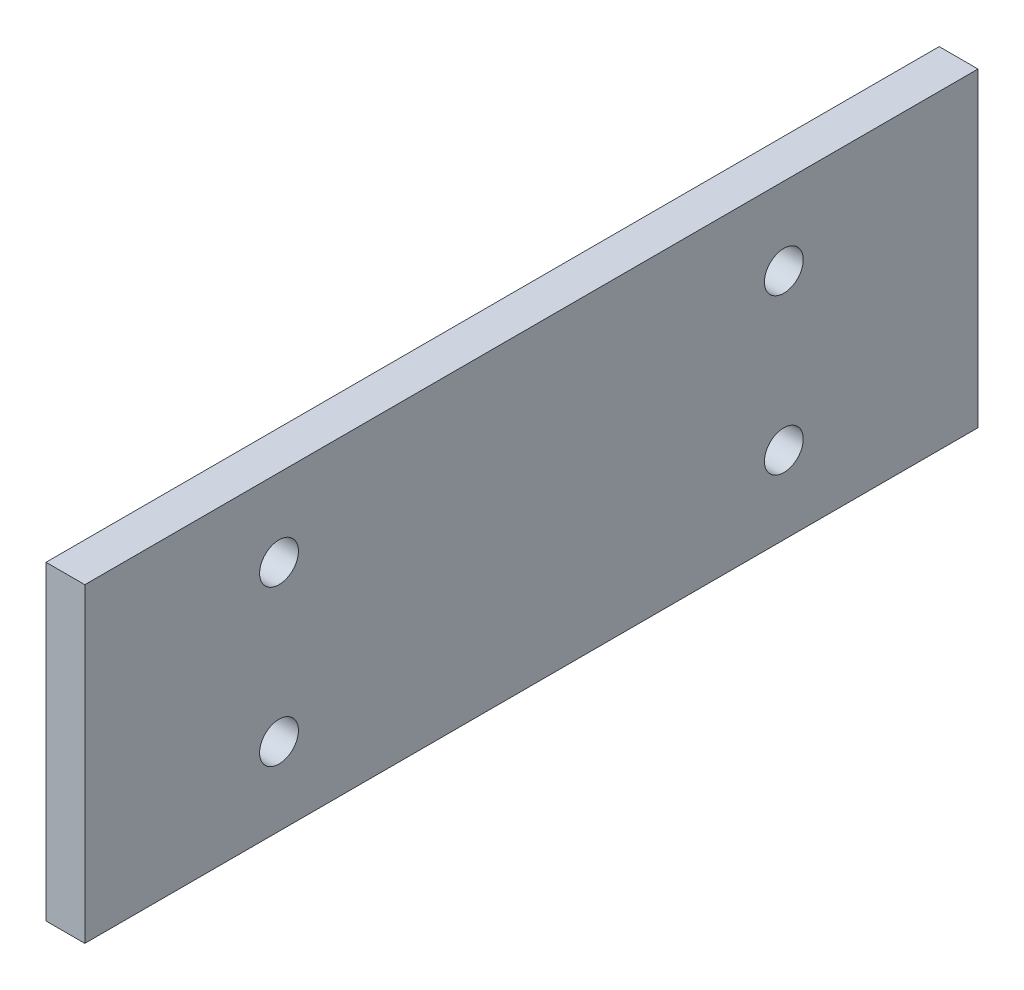
ISO-10303-21;
HEADER;
FILE_DESCRIPTION(('STEP AP214'),'2;1');
FILE_NAME('part.step','',(''),(''),'','','');
FILE_SCHEMA(('AUTOMOTIVE_DESIGN { 1 0 10303 214 1 1 1 1 }'));
ENDSEC;
DATA;
#1=APPLICATION_CONTEXT('core data for automotive mechanical design processes');
#2=APPLICATION_PROTOCOL_DEFINITION('international standard','automotive_design',2000,#1);
#3=PRODUCT_CONTEXT('',#1,'mechanical');
#4=PRODUCT('Part','Part','',(#3));
#5=PRODUCT_RELATED_PRODUCT_CATEGORY('part','',(#4));
#6=PRODUCT_DEFINITION_FORMATION('','',#4);
#7=PRODUCT_DEFINITION_CONTEXT('part definition',#1,'design');
#8=PRODUCT_DEFINITION('design','',#6,#7);
#9=PRODUCT_DEFINITION_SHAPE('','',#8);
#10=(LENGTH_UNIT() NAMED_UNIT(*) SI_UNIT(.MILLI.,.METRE.));
#11=(NAMED_UNIT(*) PLANE_ANGLE_UNIT() SI_UNIT($,.RADIAN.));
#12=(NAMED_UNIT(*) SI_UNIT($,.STERADIAN.) SOLID_ANGLE_UNIT());
#13=UNCERTAINTY_MEASURE_WITH_UNIT(LENGTH_MEASURE(1.E-05),#10,'distance_accuracy_value','');
#14=(GEOMETRIC_REPRESENTATION_CONTEXT(3) GLOBAL_UNCERTAINTY_ASSIGNED_CONTEXT((#13)) GLOBAL_UNIT_ASSIGNED_CONTEXT((#10,
#11,#12)) REPRESENTATION_CONTEXT('',''));
#15=CARTESIAN_POINT('',(0.,0.,0.));
#16=DIRECTION('',(0.,0.,1.));
#17=DIRECTION('',(1.,0.,0.));
#18=AXIS2_PLACEMENT_3D('',#15,#16,#17);
#19=CARTESIAN_POINT('',(5.,0.,0.));
#20=DIRECTION('',(1.,0.,0.));
#21=DIRECTION('',(0.,0.,-1.));
#22=AXIS2_PLACEMENT_3D('',#19,#20,#21);
#23=PLANE('',#22);
#24=CARTESIAN_POINT('',(5.,9.99999999999998,25.));
#25=DIRECTION('',(1.,0.,0.));
#26=DIRECTION('',(0.,0.,1.));
#27=AXIS2_PLACEMENT_3D('',#24,#25,#26);
#28=CIRCLE('',#27,2.5);
#29=CARTESIAN_POINT('',(5.,9.99999999999998,27.5));
#30=VERTEX_POINT('',#29);
#31=EDGE_CURVE('E148',#30,#30,#28,.T.);
#32=ORIENTED_EDGE('',*,*,#31,.F.);
#33=EDGE_LOOP('',(#32));
#34=FACE_BOUND('',#33,.T.);
#35=CARTESIAN_POINT('',(5.,30.,90.));
#36=DIRECTION('',(1.,0.,0.));
#37=DIRECTION('',(0.,0.,-1.));
#38=AXIS2_PLACEMENT_3D('',#35,#36,#37);
#39=CIRCLE('',#38,2.5);
#40=CARTESIAN_POINT('',(5.,30.,87.5));
#41=VERTEX_POINT('',#40);
#42=EDGE_CURVE('E118',#41,#41,#39,.T.);
#43=ORIENTED_EDGE('',*,*,#42,.F.);
#44=EDGE_LOOP('',(#43));
#45=FACE_BOUND('',#44,.T.);
#46=DIRECTION('',(0.,1.,0.));
#47=VECTOR('',#46,1.);
#48=CARTESIAN_POINT('',(5.,0.,0.));
#49=LINE('',#48,#47);
#50=CARTESIAN_POINT('',(5.,0.,0.));
#51=VERTEX_POINT('',#50);
#52=CARTESIAN_POINT('',(5.,40.,0.));
#53=VERTEX_POINT('',#52);
#54=EDGE_CURVE('E98',#51,#53,#49,.T.);
#55=ORIENTED_EDGE('',*,*,#54,.T.);
#56=DIRECTION('',(0.,0.,1.));
#57=VECTOR('',#56,1.);
#58=CARTESIAN_POINT('',(5.,40.,0.));
#59=LINE('',#58,#57);
#60=CARTESIAN_POINT('',(5.,40.,115.));
#61=VERTEX_POINT('',#60);
#62=EDGE_CURVE('E93',#53,#61,#59,.T.);
#63=ORIENTED_EDGE('',*,*,#62,.T.);
#64=DIRECTION('',(0.,-1.,0.));
#65=VECTOR('',#64,1.);
#66=CARTESIAN_POINT('',(5.,0.,115.));
#67=LINE('',#66,#65);
#68=CARTESIAN_POINT('',(5.,0.,115.));
#69=VERTEX_POINT('',#68);
#70=EDGE_CURVE('E96',#61,#69,#67,.T.);
#71=ORIENTED_EDGE('',*,*,#70,.T.);
#72=DIRECTION('',(0.,0.,-1.));
#73=VECTOR('',#72,1.);
#74=CARTESIAN_POINT('',(5.,0.,0.));
#75=LINE('',#74,#73);
#76=EDGE_CURVE('E63',#69,#51,#75,.T.);
#77=ORIENTED_EDGE('',*,*,#76,.T.);
#78=EDGE_LOOP('',(#55,#63,#71,#77));
#79=FACE_BOUND('',#78,.T.);
#80=CARTESIAN_POINT('',(5.,9.99999999999998,90.));
#81=DIRECTION('',(1.,0.,0.));
#82=DIRECTION('',(0.,0.,-1.));
#83=AXIS2_PLACEMENT_3D('',#80,#81,#82);
#84=CIRCLE('',#83,2.5);
#85=CARTESIAN_POINT('',(5.,9.99999999999998,87.5));
#86=VERTEX_POINT('',#85);
#87=EDGE_CURVE('E140',#86,#86,#84,.T.);
#88=ORIENTED_EDGE('',*,*,#87,.F.);
#89=EDGE_LOOP('',(#88));
#90=FACE_BOUND('',#89,.T.);
#91=CARTESIAN_POINT('',(5.,30.,25.));
#92=DIRECTION('',(1.,0.,0.));
#93=DIRECTION('',(0.,0.,1.));
#94=AXIS2_PLACEMENT_3D('',#91,#92,#93);
#95=CIRCLE('',#94,2.5);
#96=CARTESIAN_POINT('',(5.,30.,27.5));
#97=VERTEX_POINT('',#96);
#98=EDGE_CURVE('E156',#97,#97,#95,.T.);
#99=ORIENTED_EDGE('',*,*,#98,.F.);
#100=EDGE_LOOP('',(#99));
#101=FACE_BOUND('',#100,.T.);
#102=ADVANCED_FACE('F45',(#34,#45,#79,#90,#101),#23,.T.);
#103=CARTESIAN_POINT('',(0.,0.,0.));
#104=DIRECTION('',(1.,0.,0.));
#105=DIRECTION('',(0.,0.,-1.));
#106=AXIS2_PLACEMENT_3D('',#103,#104,#105);
#107=PLANE('',#106);
#108=DIRECTION('',(0.,1.,0.));
#109=VECTOR('',#108,1.);
#110=CARTESIAN_POINT('',(0.,0.,0.));
#111=LINE('',#110,#109);
#112=CARTESIAN_POINT('',(0.,0.,0.));
#113=VERTEX_POINT('',#112);
#114=CARTESIAN_POINT('',(0.,40.,0.));
#115=VERTEX_POINT('',#114);
#116=EDGE_CURVE('E114',#113,#115,#111,.T.);
#117=ORIENTED_EDGE('',*,*,#116,.F.);
#118=DIRECTION('',(0.,0.,-1.));
#119=VECTOR('',#118,1.);
#120=CARTESIAN_POINT('',(0.,0.,0.));
#121=LINE('',#120,#119);
#122=CARTESIAN_POINT('',(0.,0.,115.));
#123=VERTEX_POINT('',#122);
#124=EDGE_CURVE('E86',#123,#113,#121,.T.);
#125=ORIENTED_EDGE('',*,*,#124,.F.);
#126=DIRECTION('',(0.,-1.,0.));
#127=VECTOR('',#126,1.);
#128=CARTESIAN_POINT('',(0.,0.,115.));
#129=LINE('',#128,#127);
#130=CARTESIAN_POINT('',(0.,40.,115.));
#131=VERTEX_POINT('',#130);
#132=EDGE_CURVE('E80',#131,#123,#129,.T.);
#133=ORIENTED_EDGE('',*,*,#132,.F.);
#134=DIRECTION('',(0.,0.,1.));
#135=VECTOR('',#134,1.);
#136=CARTESIAN_POINT('',(0.,40.,0.));
#137=LINE('',#136,#135);
#138=EDGE_CURVE('E103',#115,#131,#137,.T.);
#139=ORIENTED_EDGE('',*,*,#138,.F.);
#140=EDGE_LOOP('',(#117,#125,#133,#139));
#141=FACE_BOUND('',#140,.T.);
#142=CARTESIAN_POINT('',(0.,30.,90.));
#143=DIRECTION('',(1.,0.,0.));
#144=DIRECTION('',(0.,0.,-1.));
#145=AXIS2_PLACEMENT_3D('',#142,#143,#144);
#146=CIRCLE('',#145,2.5);
#147=CARTESIAN_POINT('',(0.,30.,87.5));
#148=VERTEX_POINT('',#147);
#149=EDGE_CURVE('E136',#148,#148,#146,.T.);
#150=ORIENTED_EDGE('',*,*,#149,.T.);
#151=EDGE_LOOP('',(#150));
#152=FACE_BOUND('',#151,.T.);
#153=CARTESIAN_POINT('',(0.,9.99999999999998,90.));
#154=DIRECTION('',(1.,0.,0.));
#155=DIRECTION('',(0.,0.,-1.));
#156=AXIS2_PLACEMENT_3D('',#153,#154,#155);
#157=CIRCLE('',#156,2.5);
#158=CARTESIAN_POINT('',(0.,9.99999999999998,87.5));
#159=VERTEX_POINT('',#158);
#160=EDGE_CURVE('E144',#159,#159,#157,.T.);
#161=ORIENTED_EDGE('',*,*,#160,.T.);
#162=EDGE_LOOP('',(#161));
#163=FACE_BOUND('',#162,.T.);
#164=CARTESIAN_POINT('',(0.,9.99999999999998,25.));
#165=DIRECTION('',(1.,0.,0.));
#166=DIRECTION('',(0.,0.,1.));
#167=AXIS2_PLACEMENT_3D('',#164,#165,#166);
#168=CIRCLE('',#167,2.5);
#169=CARTESIAN_POINT('',(0.,9.99999999999998,27.5));
#170=VERTEX_POINT('',#169);
#171=EDGE_CURVE('E152',#170,#170,#168,.T.);
#172=ORIENTED_EDGE('',*,*,#171,.T.);
#173=EDGE_LOOP('',(#172));
#174=FACE_BOUND('',#173,.T.);
#175=CARTESIAN_POINT('',(0.,30.,25.));
#176=DIRECTION('',(1.,0.,0.));
#177=DIRECTION('',(0.,0.,1.));
#178=AXIS2_PLACEMENT_3D('',#175,#176,#177);
#179=CIRCLE('',#178,2.5);
#180=CARTESIAN_POINT('',(0.,30.,27.5));
#181=VERTEX_POINT('',#180);
#182=EDGE_CURVE('E160',#181,#181,#179,.T.);
#183=ORIENTED_EDGE('',*,*,#182,.T.);
#184=EDGE_LOOP('',(#183));
#185=FACE_BOUND('',#184,.T.);
#186=ADVANCED_FACE('F131',(#141,#152,#163,#174,#185),#107,.F.);
#187=CARTESIAN_POINT('',(5.,0.,0.));
#188=DIRECTION('',(0.,0.,1.));
#189=DIRECTION('',(0.,-1.,0.));
#190=AXIS2_PLACEMENT_3D('',#187,#188,#189);
#191=PLANE('',#190);
#192=ORIENTED_EDGE('',*,*,#116,.T.);
#193=DIRECTION('',(-1.,0.,0.));
#194=VECTOR('',#193,1.);
#195=CARTESIAN_POINT('',(5.,40.,0.));
#196=LINE('',#195,#194);
#197=EDGE_CURVE('E11',#53,#115,#196,.T.);
#198=ORIENTED_EDGE('',*,*,#197,.F.);
#199=ORIENTED_EDGE('',*,*,#54,.F.);
#200=DIRECTION('',(-1.,0.,0.));
#201=VECTOR('',#200,1.);
#202=CARTESIAN_POINT('',(5.,0.,0.));
#203=LINE('',#202,#201);
#204=EDGE_CURVE('E110',#51,#113,#203,.T.);
#205=ORIENTED_EDGE('',*,*,#204,.T.);
#206=EDGE_LOOP('',(#192,#198,#199,#205));
#207=FACE_BOUND('',#206,.T.);
#208=ADVANCED_FACE('F47',(#207),#191,.F.);
#209=CARTESIAN_POINT('',(5.,40.,0.));
#210=DIRECTION('',(0.,-1.,0.));
#211=DIRECTION('',(0.,0.,-1.));
#212=AXIS2_PLACEMENT_3D('',#209,#210,#211);
#213=PLANE('',#212);
#214=ORIENTED_EDGE('',*,*,#138,.T.);
#215=DIRECTION('',(-1.,0.,0.));
#216=VECTOR('',#215,1.);
#217=CARTESIAN_POINT('',(5.,40.,115.));
#218=LINE('',#217,#216);
#219=EDGE_CURVE('E55',#61,#131,#218,.T.);
#220=ORIENTED_EDGE('',*,*,#219,.F.);
#221=ORIENTED_EDGE('',*,*,#62,.F.);
#222=ORIENTED_EDGE('',*,*,#197,.T.);
#223=EDGE_LOOP('',(#214,#220,#221,#222));
#224=FACE_BOUND('',#223,.T.);
#225=ADVANCED_FACE('F102',(#224),#213,.F.);
#226=CARTESIAN_POINT('',(5.,0.,115.));
#227=DIRECTION('',(0.,0.,-1.));
#228=DIRECTION('',(-1.,0.,0.));
#229=AXIS2_PLACEMENT_3D('',#226,#227,#228);
#230=PLANE('',#229);
#231=ORIENTED_EDGE('',*,*,#132,.T.);
#232=DIRECTION('',(-1.,0.,0.));
#233=VECTOR('',#232,1.);
#234=CARTESIAN_POINT('',(5.,0.,115.));
#235=LINE('',#234,#233);
#236=EDGE_CURVE('E105',#69,#123,#235,.T.);
#237=ORIENTED_EDGE('',*,*,#236,.F.);
#238=ORIENTED_EDGE('',*,*,#70,.F.);
#239=ORIENTED_EDGE('',*,*,#219,.T.);
#240=EDGE_LOOP('',(#231,#237,#238,#239));
#241=FACE_BOUND('',#240,.T.);
#242=ADVANCED_FACE('F106',(#241),#230,.F.);
#243=CARTESIAN_POINT('',(5.,0.,0.));
#244=DIRECTION('',(0.,1.,0.));
#245=DIRECTION('',(0.,0.,1.));
#246=AXIS2_PLACEMENT_3D('',#243,#244,#245);
#247=PLANE('',#246);
#248=ORIENTED_EDGE('',*,*,#124,.T.);
#249=ORIENTED_EDGE('',*,*,#204,.F.);
#250=ORIENTED_EDGE('',*,*,#76,.F.);
#251=ORIENTED_EDGE('',*,*,#236,.T.);
#252=EDGE_LOOP('',(#248,#249,#250,#251));
#253=FACE_BOUND('',#252,.T.);
#254=ADVANCED_FACE('F128',(#253),#247,.F.);
#255=CARTESIAN_POINT('',(5.,30.,90.));
#256=DIRECTION('',(-1.,0.,0.));
#257=DIRECTION('',(0.,0.,1.));
#258=AXIS2_PLACEMENT_3D('',#255,#256,#257);
#259=CYLINDRICAL_SURFACE('',#258,2.5);
#260=ORIENTED_EDGE('',*,*,#42,.T.);
#261=EDGE_LOOP('',(#260));
#262=FACE_BOUND('',#261,.T.);
#263=ORIENTED_EDGE('',*,*,#149,.F.);
#264=EDGE_LOOP('',(#263));
#265=FACE_BOUND('',#264,.T.);
#266=ADVANCED_FACE('F181',(#262,#265),#259,.F.);
#267=CARTESIAN_POINT('',(5.,9.99999999999998,90.));
#268=DIRECTION('',(-1.,0.,0.));
#269=DIRECTION('',(0.,0.,1.));
#270=AXIS2_PLACEMENT_3D('',#267,#268,#269);
#271=CYLINDRICAL_SURFACE('',#270,2.5);
#272=ORIENTED_EDGE('',*,*,#87,.T.);
#273=EDGE_LOOP('',(#272));
#274=FACE_BOUND('',#273,.T.);
#275=ORIENTED_EDGE('',*,*,#160,.F.);
#276=EDGE_LOOP('',(#275));
#277=FACE_BOUND('',#276,.T.);
#278=ADVANCED_FACE('F226',(#274,#277),#271,.F.);
#279=CARTESIAN_POINT('',(5.,9.99999999999998,25.));
#280=DIRECTION('',(-1.,0.,0.));
#281=DIRECTION('',(0.,0.,1.));
#282=AXIS2_PLACEMENT_3D('',#279,#280,#281);
#283=CYLINDRICAL_SURFACE('',#282,2.5);
#284=ORIENTED_EDGE('',*,*,#31,.T.);
#285=EDGE_LOOP('',(#284));
#286=FACE_BOUND('',#285,.T.);
#287=ORIENTED_EDGE('',*,*,#171,.F.);
#288=EDGE_LOOP('',(#287));
#289=FACE_BOUND('',#288,.T.);
#290=ADVANCED_FACE('F234',(#286,#289),#283,.F.);
#291=CARTESIAN_POINT('',(5.,30.,25.));
#292=DIRECTION('',(-1.,0.,0.));
#293=DIRECTION('',(0.,0.,1.));
#294=AXIS2_PLACEMENT_3D('',#291,#292,#293);
#295=CYLINDRICAL_SURFACE('',#294,2.5);
#296=ORIENTED_EDGE('',*,*,#98,.T.);
#297=EDGE_LOOP('',(#296));
#298=FACE_BOUND('',#297,.T.);
#299=ORIENTED_EDGE('',*,*,#182,.F.);
#300=EDGE_LOOP('',(#299));
#301=FACE_BOUND('',#300,.T.);
#302=ADVANCED_FACE('F168',(#298,#301),#295,.F.);
#303=CLOSED_SHELL('',(#102,#186,#208,#225,#242,#254,#266,#278,#290,#302));
#304=MANIFOLD_SOLID_BREP('B2',#303);
#305=ADVANCED_BREP_SHAPE_REPRESENTATION('',(#18,#304),#14);
#306=SHAPE_DEFINITION_REPRESENTATION(#9,#305);
ENDSEC;
END-ISO-10303-21;
